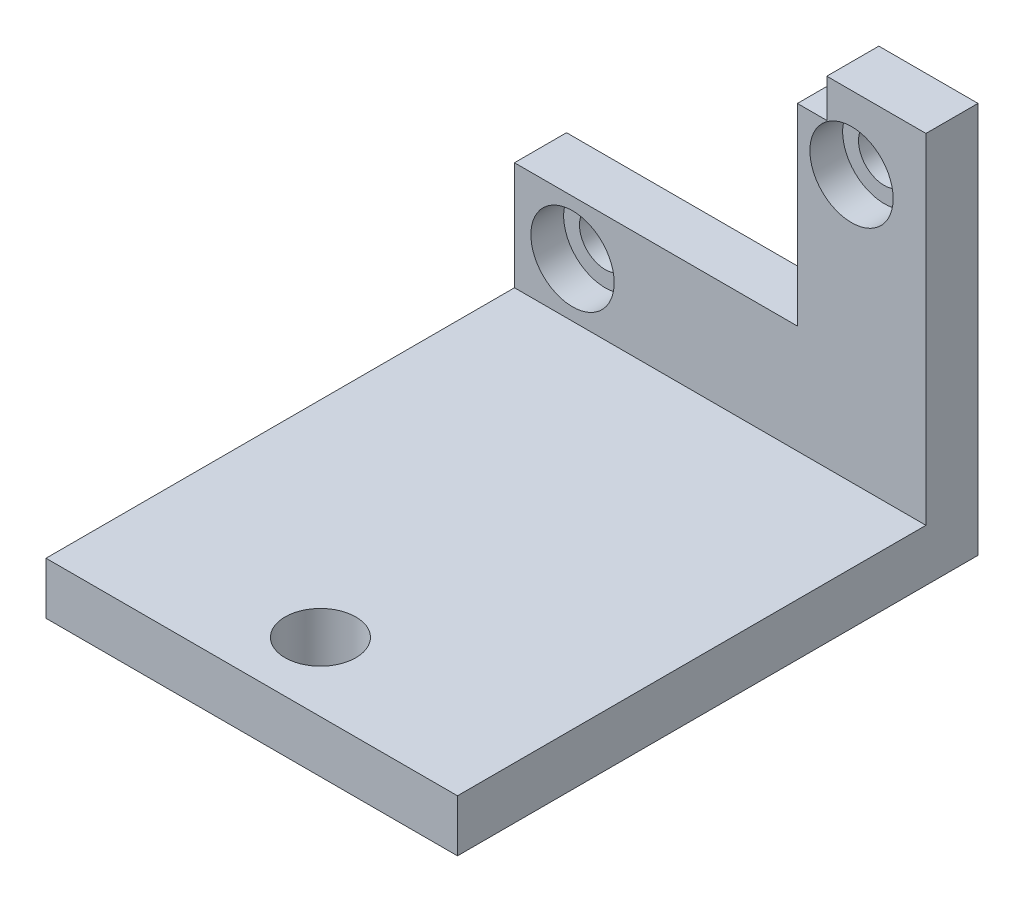
ISO-10303-21;
HEADER;
FILE_DESCRIPTION(('STEP AP214'),'2;1');
FILE_NAME('part.step','',(''),(''),'','','');
FILE_SCHEMA(('AUTOMOTIVE_DESIGN { 1 0 10303 214 1 1 1 1 }'));
ENDSEC;
DATA;
#1=APPLICATION_CONTEXT('core data for automotive mechanical design processes');
#2=APPLICATION_PROTOCOL_DEFINITION('international standard','automotive_design',2000,#1);
#3=PRODUCT_CONTEXT('',#1,'mechanical');
#4=PRODUCT('Part','Part','',(#3));
#5=PRODUCT_RELATED_PRODUCT_CATEGORY('part','',(#4));
#6=PRODUCT_DEFINITION_FORMATION('','',#4);
#7=PRODUCT_DEFINITION_CONTEXT('part definition',#1,'design');
#8=PRODUCT_DEFINITION('design','',#6,#7);
#9=PRODUCT_DEFINITION_SHAPE('','',#8);
#10=(LENGTH_UNIT() NAMED_UNIT(*) SI_UNIT(.MILLI.,.METRE.));
#11=(NAMED_UNIT(*) PLANE_ANGLE_UNIT() SI_UNIT($,.RADIAN.));
#12=(NAMED_UNIT(*) SI_UNIT($,.STERADIAN.) SOLID_ANGLE_UNIT());
#13=UNCERTAINTY_MEASURE_WITH_UNIT(LENGTH_MEASURE(1.E-05),#10,'distance_accuracy_value','');
#14=(GEOMETRIC_REPRESENTATION_CONTEXT(3) GLOBAL_UNCERTAINTY_ASSIGNED_CONTEXT((#13)) GLOBAL_UNIT_ASSIGNED_CONTEXT((#10,
#11,#12)) REPRESENTATION_CONTEXT('',''));
#15=CARTESIAN_POINT('',(0.,0.,0.));
#16=DIRECTION('',(0.,0.,1.));
#17=DIRECTION('',(1.,0.,0.));
#18=AXIS2_PLACEMENT_3D('',#15,#16,#17);
#19=CARTESIAN_POINT('',(-9.32078617099483,-4.74040490381666,3.175));
#20=DIRECTION('',(0.,0.,-1.));
#21=DIRECTION('',(-1.,0.,0.));
#22=AXIS2_PLACEMENT_3D('',#19,#20,#21);
#23=CYLINDRICAL_SURFACE('',#22,1.5748);
#24=CARTESIAN_POINT('',(-9.32078617099483,-4.74040490381666,0.));
#25=DIRECTION('',(0.,0.,1.));
#26=DIRECTION('',(1.,0.,0.));
#27=AXIS2_PLACEMENT_3D('',#24,#25,#26);
#28=CIRCLE('',#27,1.5748);
#29=CARTESIAN_POINT('',(-7.74598617099483,-4.74040490381666,0.));
#30=VERTEX_POINT('',#29);
#31=EDGE_CURVE('E285',#30,#30,#28,.T.);
#32=ORIENTED_EDGE('',*,*,#31,.F.);
#33=EDGE_LOOP('',(#32));
#34=FACE_BOUND('',#33,.T.);
#35=CARTESIAN_POINT('',(-9.32078617099483,-4.74040490381666,1.175));
#36=DIRECTION('',(0.,0.,1.));
#37=DIRECTION('',(1.,0.,0.));
#38=AXIS2_PLACEMENT_3D('',#35,#36,#37);
#39=CIRCLE('',#38,1.5748);
#40=CARTESIAN_POINT('',(-7.74598617099483,-4.74040490381666,1.175));
#41=VERTEX_POINT('',#40);
#42=EDGE_CURVE('E148',#41,#41,#39,.T.);
#43=ORIENTED_EDGE('',*,*,#42,.T.);
#44=EDGE_LOOP('',(#43));
#45=FACE_BOUND('',#44,.T.);
#46=ADVANCED_FACE('F144',(#34,#45),#23,.F.);
#47=CARTESIAN_POINT('',(7.69721382900516,8.21359509618334,3.175));
#48=DIRECTION('',(0.,0.,-1.));
#49=DIRECTION('',(-1.,0.,0.));
#50=AXIS2_PLACEMENT_3D('',#47,#48,#49);
#51=CYLINDRICAL_SURFACE('',#50,1.5748);
#52=CARTESIAN_POINT('',(7.69721382900516,8.21359509618334,0.));
#53=DIRECTION('',(0.,0.,1.));
#54=DIRECTION('',(1.,0.,0.));
#55=AXIS2_PLACEMENT_3D('',#52,#53,#54);
#56=CIRCLE('',#55,1.5748);
#57=CARTESIAN_POINT('',(9.27201382900516,8.21359509618334,0.));
#58=VERTEX_POINT('',#57);
#59=EDGE_CURVE('E300',#58,#58,#56,.T.);
#60=ORIENTED_EDGE('',*,*,#59,.F.);
#61=EDGE_LOOP('',(#60));
#62=FACE_BOUND('',#61,.T.);
#63=CARTESIAN_POINT('',(7.69721382900516,8.21359509618334,1.175));
#64=DIRECTION('',(0.,0.,1.));
#65=DIRECTION('',(1.,0.,0.));
#66=AXIS2_PLACEMENT_3D('',#63,#64,#65);
#67=CIRCLE('',#66,1.5748);
#68=CARTESIAN_POINT('',(9.27201382900516,8.21359509618334,1.175));
#69=VERTEX_POINT('',#68);
#70=EDGE_CURVE('E241',#69,#69,#67,.T.);
#71=ORIENTED_EDGE('',*,*,#70,.T.);
#72=EDGE_LOOP('',(#71));
#73=FACE_BOUND('',#72,.T.);
#74=ADVANCED_FACE('F376',(#62,#73),#51,.F.);
#75=CARTESIAN_POINT('',(0.,-1.43840490381666,3.175));
#76=DIRECTION('',(0.,-1.,0.));
#77=DIRECTION('',(1.,0.,0.));
#78=AXIS2_PLACEMENT_3D('',#75,#76,#77);
#79=PLANE('',#78);
#80=DIRECTION('',(-1.,0.,0.));
#81=VECTOR('',#80,1.);
#82=CARTESIAN_POINT('',(0.,-1.43840490381666,0.));
#83=LINE('',#82,#81);
#84=CARTESIAN_POINT('',(4.39521382900517,-1.43840490381666,0.));
#85=VERTEX_POINT('',#84);
#86=CARTESIAN_POINT('',(-12.8607861709948,-1.43840490381666,0.));
#87=VERTEX_POINT('',#86);
#88=EDGE_CURVE('E205',#85,#87,#83,.T.);
#89=ORIENTED_EDGE('',*,*,#88,.T.);
#90=DIRECTION('',(0.,0.,-1.));
#91=VECTOR('',#90,1.);
#92=CARTESIAN_POINT('',(-12.8607861709948,-1.43840490381666,3.175));
#93=LINE('',#92,#91);
#94=CARTESIAN_POINT('',(-12.8607861709948,-1.43840490381666,3.175));
#95=VERTEX_POINT('',#94);
#96=EDGE_CURVE('E12',#95,#87,#93,.T.);
#97=ORIENTED_EDGE('',*,*,#96,.F.);
#98=DIRECTION('',(-1.,0.,0.));
#99=VECTOR('',#98,1.);
#100=CARTESIAN_POINT('',(0.,-1.43840490381666,3.175));
#101=LINE('',#100,#99);
#102=CARTESIAN_POINT('',(4.39521382900517,-1.43840490381666,3.175));
#103=VERTEX_POINT('',#102);
#104=EDGE_CURVE('E227',#103,#95,#101,.T.);
#105=ORIENTED_EDGE('',*,*,#104,.F.);
#106=DIRECTION('',(0.,0.,-1.));
#107=VECTOR('',#106,1.);
#108=CARTESIAN_POINT('',(4.39521382900517,-1.43840490381666,3.175));
#109=LINE('',#108,#107);
#110=EDGE_CURVE('E220',#103,#85,#109,.T.);
#111=ORIENTED_EDGE('',*,*,#110,.T.);
#112=EDGE_LOOP('',(#89,#97,#105,#111));
#113=FACE_BOUND('',#112,.T.);
#114=ADVANCED_FACE('F226',(#113),#79,.F.);
#115=CARTESIAN_POINT('',(-12.8607861709948,0.,3.175));
#116=DIRECTION('',(1.,0.,0.));
#117=DIRECTION('',(0.,0.,-1.));
#118=AXIS2_PLACEMENT_3D('',#115,#116,#117);
#119=PLANE('',#118);
#120=DIRECTION('',(0.,-1.,0.));
#121=VECTOR('',#120,1.);
#122=CARTESIAN_POINT('',(-12.8607861709948,0.,0.));
#123=LINE('',#122,#121);
#124=CARTESIAN_POINT('',(-12.8607861709948,-11.2174049038166,0.));
#125=VERTEX_POINT('',#124);
#126=EDGE_CURVE('E210',#87,#125,#123,.T.);
#127=ORIENTED_EDGE('',*,*,#126,.T.);
#128=DIRECTION('',(0.,0.,-1.));
#129=VECTOR('',#128,1.);
#130=CARTESIAN_POINT('',(-12.8607861709948,-11.2174049038166,31.75));
#131=LINE('',#130,#129);
#132=CARTESIAN_POINT('',(-12.8607861709948,-11.2174049038166,31.75));
#133=VERTEX_POINT('',#132);
#134=EDGE_CURVE('E288',#133,#125,#131,.T.);
#135=ORIENTED_EDGE('',*,*,#134,.F.);
#136=DIRECTION('',(0.,1.,0.));
#137=VECTOR('',#136,1.);
#138=CARTESIAN_POINT('',(-12.8607861709948,-8.04240490381664,31.75));
#139=LINE('',#138,#137);
#140=CARTESIAN_POINT('',(-12.8607861709948,-8.04240490381664,31.75));
#141=VERTEX_POINT('',#140);
#142=EDGE_CURVE('E274',#133,#141,#139,.T.);
#143=ORIENTED_EDGE('',*,*,#142,.T.);
#144=DIRECTION('',(0.,0.,-1.));
#145=VECTOR('',#144,1.);
#146=CARTESIAN_POINT('',(-12.8607861709948,-8.04240490381664,31.75));
#147=LINE('',#146,#145);
#148=CARTESIAN_POINT('',(-12.8607861709948,-8.04240490381664,3.175));
#149=VERTEX_POINT('',#148);
#150=EDGE_CURVE('E286',#141,#149,#147,.T.);
#151=ORIENTED_EDGE('',*,*,#150,.T.);
#152=DIRECTION('',(0.,-1.,0.));
#153=VECTOR('',#152,1.);
#154=CARTESIAN_POINT('',(-12.8607861709948,0.,3.175));
#155=LINE('',#154,#153);
#156=EDGE_CURVE('E162',#95,#149,#155,.T.);
#157=ORIENTED_EDGE('',*,*,#156,.F.);
#158=ORIENTED_EDGE('',*,*,#96,.T.);
#159=EDGE_LOOP('',(#127,#135,#143,#151,#157,#158));
#160=FACE_BOUND('',#159,.T.);
#161=ADVANCED_FACE('F355',(#160),#119,.F.);
#162=CARTESIAN_POINT('',(0.,0.,3.175));
#163=DIRECTION('',(0.,0.,1.));
#164=DIRECTION('',(1.,0.,0.));
#165=AXIS2_PLACEMENT_3D('',#162,#163,#164);
#166=PLANE('',#165);
#167=CARTESIAN_POINT('',(7.69721382900516,8.21359509618334,3.175));
#168=DIRECTION('',(0.,0.,1.));
#169=DIRECTION('',(1.,0.,0.));
#170=AXIS2_PLACEMENT_3D('',#167,#168,#169);
#171=CIRCLE('',#170,2.54);
#172=CARTESIAN_POINT('',(10.2372138290052,8.21359509618334,3.175));
#173=VERTEX_POINT('',#172);
#174=EDGE_CURVE('E249',#173,#173,#171,.T.);
#175=ORIENTED_EDGE('',*,*,#174,.F.);
#176=EDGE_LOOP('',(#175));
#177=FACE_BOUND('',#176,.T.);
#178=CARTESIAN_POINT('',(-9.32078617099483,-4.74040490381666,3.175));
#179=DIRECTION('',(0.,0.,1.));
#180=DIRECTION('',(1.,0.,0.));
#181=AXIS2_PLACEMENT_3D('',#178,#179,#180);
#182=CIRCLE('',#181,2.54);
#183=CARTESIAN_POINT('',(-6.78078617099483,-4.74040490381666,3.175));
#184=VERTEX_POINT('',#183);
#185=EDGE_CURVE('E259',#184,#184,#182,.T.);
#186=ORIENTED_EDGE('',*,*,#185,.F.);
#187=EDGE_LOOP('',(#186));
#188=FACE_BOUND('',#187,.T.);
#189=ORIENTED_EDGE('',*,*,#104,.T.);
#190=ORIENTED_EDGE('',*,*,#156,.T.);
#191=DIRECTION('',(-1.,0.,0.));
#192=VECTOR('',#191,1.);
#193=CARTESIAN_POINT('',(0.,-8.04240490381664,3.175));
#194=LINE('',#193,#192);
#195=CARTESIAN_POINT('',(12.2372138290052,-8.04240490381664,3.175));
#196=VERTEX_POINT('',#195);
#197=EDGE_CURVE('E154',#196,#149,#194,.T.);
#198=ORIENTED_EDGE('',*,*,#197,.F.);
#199=DIRECTION('',(0.,1.,0.));
#200=VECTOR('',#199,1.);
#201=CARTESIAN_POINT('',(12.2372138290052,-8.04240490381664,3.175));
#202=LINE('',#201,#200);
#203=CARTESIAN_POINT('',(12.2372138290052,12.6585950961833,3.175));
#204=VERTEX_POINT('',#203);
#205=EDGE_CURVE('E223',#196,#204,#202,.T.);
#206=ORIENTED_EDGE('',*,*,#205,.T.);
#207=DIRECTION('',(-1.,0.,0.));
#208=VECTOR('',#207,1.);
#209=CARTESIAN_POINT('',(12.2372138290052,12.6585950961833,3.175));
#210=LINE('',#209,#208);
#211=CARTESIAN_POINT('',(6.18817038186677,12.6585950961833,3.175));
#212=VERTEX_POINT('',#211);
#213=EDGE_CURVE('E305',#204,#212,#210,.T.);
#214=ORIENTED_EDGE('',*,*,#213,.T.);
#215=DIRECTION('',(0.,1.,0.));
#216=VECTOR('',#215,1.);
#217=CARTESIAN_POINT('',(6.18817038186677,10.3218119533511,3.175));
#218=LINE('',#217,#216);
#219=CARTESIAN_POINT('',(6.18817038186677,10.3218119533511,3.175));
#220=VERTEX_POINT('',#219);
#221=EDGE_CURVE('E307',#220,#212,#218,.T.);
#222=ORIENTED_EDGE('',*,*,#221,.F.);
#223=DIRECTION('',(1.,0.,0.));
#224=VECTOR('',#223,1.);
#225=CARTESIAN_POINT('',(4.39521382900517,10.3218119533511,3.175));
#226=LINE('',#225,#224);
#227=CARTESIAN_POINT('',(4.39521382900517,10.3218119533511,3.175));
#228=VERTEX_POINT('',#227);
#229=EDGE_CURVE('E233',#228,#220,#226,.T.);
#230=ORIENTED_EDGE('',*,*,#229,.F.);
#231=DIRECTION('',(0.,-1.,0.));
#232=VECTOR('',#231,1.);
#233=CARTESIAN_POINT('',(4.39521382900517,10.3218119533511,3.175));
#234=LINE('',#233,#232);
#235=EDGE_CURVE('E229',#228,#103,#234,.T.);
#236=ORIENTED_EDGE('',*,*,#235,.T.);
#237=EDGE_LOOP('',(#189,#190,#198,#206,#214,#222,#230,#236));
#238=FACE_BOUND('',#237,.T.);
#239=ADVANCED_FACE('F362',(#177,#188,#238),#166,.T.);
#240=CARTESIAN_POINT('',(0.,0.,0.));
#241=DIRECTION('',(0.,0.,1.));
#242=DIRECTION('',(1.,0.,0.));
#243=AXIS2_PLACEMENT_3D('',#240,#241,#242);
#244=PLANE('',#243);
#245=ORIENTED_EDGE('',*,*,#88,.F.);
#246=DIRECTION('',(0.,-1.,0.));
#247=VECTOR('',#246,1.);
#248=CARTESIAN_POINT('',(4.39521382900517,7.82738812093123,0.));
#249=LINE('',#248,#247);
#250=CARTESIAN_POINT('',(4.39521382900517,10.3218119533511,0.));
#251=VERTEX_POINT('',#250);
#252=EDGE_CURVE('E202',#251,#85,#249,.T.);
#253=ORIENTED_EDGE('',*,*,#252,.F.);
#254=DIRECTION('',(1.,0.,0.));
#255=VECTOR('',#254,1.);
#256=CARTESIAN_POINT('',(4.39521382900517,10.3218119533511,0.));
#257=LINE('',#256,#255);
#258=CARTESIAN_POINT('',(6.18817038186677,10.3218119533511,0.));
#259=VERTEX_POINT('',#258);
#260=EDGE_CURVE('E224',#251,#259,#257,.T.);
#261=ORIENTED_EDGE('',*,*,#260,.T.);
#262=DIRECTION('',(0.,1.,0.));
#263=VECTOR('',#262,1.);
#264=CARTESIAN_POINT('',(6.18817038186677,10.3218119533511,0.));
#265=LINE('',#264,#263);
#266=CARTESIAN_POINT('',(6.18817038186677,12.6585950961833,0.));
#267=VERTEX_POINT('',#266);
#268=EDGE_CURVE('E317',#259,#267,#265,.T.);
#269=ORIENTED_EDGE('',*,*,#268,.T.);
#270=DIRECTION('',(-1.,0.,0.));
#271=VECTOR('',#270,1.);
#272=CARTESIAN_POINT('',(7.69721382900516,12.6585950961833,0.));
#273=LINE('',#272,#271);
#274=CARTESIAN_POINT('',(12.2372138290052,12.6585950961833,0.));
#275=VERTEX_POINT('',#274);
#276=EDGE_CURVE('E314',#275,#267,#273,.T.);
#277=ORIENTED_EDGE('',*,*,#276,.F.);
#278=DIRECTION('',(0.,1.,0.));
#279=VECTOR('',#278,1.);
#280=CARTESIAN_POINT('',(12.2372138290052,-8.04240490381664,0.));
#281=LINE('',#280,#279);
#282=CARTESIAN_POINT('',(12.2372138290052,-11.2174049038166,0.));
#283=VERTEX_POINT('',#282);
#284=EDGE_CURVE('E303',#283,#275,#281,.T.);
#285=ORIENTED_EDGE('',*,*,#284,.F.);
#286=DIRECTION('',(-1.,0.,0.));
#287=VECTOR('',#286,1.);
#288=CARTESIAN_POINT('',(12.2372138290052,-11.2174049038166,0.));
#289=LINE('',#288,#287);
#290=EDGE_CURVE('E267',#283,#125,#289,.T.);
#291=ORIENTED_EDGE('',*,*,#290,.T.);
#292=ORIENTED_EDGE('',*,*,#126,.F.);
#293=EDGE_LOOP('',(#245,#253,#261,#269,#277,#285,#291,#292));
#294=FACE_BOUND('',#293,.T.);
#295=ORIENTED_EDGE('',*,*,#59,.T.);
#296=EDGE_LOOP('',(#295));
#297=FACE_BOUND('',#296,.T.);
#298=ORIENTED_EDGE('',*,*,#31,.T.);
#299=EDGE_LOOP('',(#298));
#300=FACE_BOUND('',#299,.T.);
#301=ADVANCED_FACE('F206',(#294,#297,#300),#244,.F.);
#302=CARTESIAN_POINT('',(4.39521382900517,7.82738812093123,3.175));
#303=DIRECTION('',(1.,0.,0.));
#304=DIRECTION('',(0.,0.,-1.));
#305=AXIS2_PLACEMENT_3D('',#302,#303,#304);
#306=PLANE('',#305);
#307=ORIENTED_EDGE('',*,*,#252,.T.);
#308=ORIENTED_EDGE('',*,*,#110,.F.);
#309=ORIENTED_EDGE('',*,*,#235,.F.);
#310=DIRECTION('',(0.,0.,-1.));
#311=VECTOR('',#310,1.);
#312=CARTESIAN_POINT('',(4.39521382900517,10.3218119533511,3.175));
#313=LINE('',#312,#311);
#314=EDGE_CURVE('E221',#228,#251,#313,.T.);
#315=ORIENTED_EDGE('',*,*,#314,.T.);
#316=EDGE_LOOP('',(#307,#308,#309,#315));
#317=FACE_BOUND('',#316,.T.);
#318=ADVANCED_FACE('F218',(#317),#306,.F.);
#319=CARTESIAN_POINT('',(4.39521382900517,10.3218119533511,3.175));
#320=DIRECTION('',(0.,1.,0.));
#321=DIRECTION('',(0.,0.,1.));
#322=AXIS2_PLACEMENT_3D('',#319,#320,#321);
#323=PLANE('',#322);
#324=ORIENTED_EDGE('',*,*,#260,.F.);
#325=ORIENTED_EDGE('',*,*,#314,.F.);
#326=ORIENTED_EDGE('',*,*,#229,.T.);
#327=DIRECTION('',(0.,0.,-1.));
#328=VECTOR('',#327,1.);
#329=CARTESIAN_POINT('',(6.18817038186677,10.3218119533511,3.175));
#330=LINE('',#329,#328);
#331=EDGE_CURVE('E231',#220,#259,#330,.T.);
#332=ORIENTED_EDGE('',*,*,#331,.T.);
#333=EDGE_LOOP('',(#324,#325,#326,#332));
#334=FACE_BOUND('',#333,.T.);
#335=ADVANCED_FACE('F321',(#334),#323,.T.);
#336=CARTESIAN_POINT('',(6.18817038186677,10.3218119533511,3.175));
#337=DIRECTION('',(-1.,0.,0.));
#338=DIRECTION('',(0.,0.,1.));
#339=AXIS2_PLACEMENT_3D('',#336,#337,#338);
#340=PLANE('',#339);
#341=ORIENTED_EDGE('',*,*,#268,.F.);
#342=ORIENTED_EDGE('',*,*,#331,.F.);
#343=ORIENTED_EDGE('',*,*,#221,.T.);
#344=DIRECTION('',(0.,0.,-1.));
#345=VECTOR('',#344,1.);
#346=CARTESIAN_POINT('',(6.18817038186677,12.6585950961833,3.175));
#347=LINE('',#346,#345);
#348=EDGE_CURVE('E238',#212,#267,#347,.T.);
#349=ORIENTED_EDGE('',*,*,#348,.T.);
#350=EDGE_LOOP('',(#341,#342,#343,#349));
#351=FACE_BOUND('',#350,.T.);
#352=ADVANCED_FACE('F325',(#351),#340,.T.);
#353=CARTESIAN_POINT('',(7.69721382900516,12.6585950961833,3.175));
#354=DIRECTION('',(0.,-1.,0.));
#355=DIRECTION('',(1.,0.,0.));
#356=AXIS2_PLACEMENT_3D('',#353,#354,#355);
#357=PLANE('',#356);
#358=ORIENTED_EDGE('',*,*,#276,.T.);
#359=ORIENTED_EDGE('',*,*,#348,.F.);
#360=ORIENTED_EDGE('',*,*,#213,.F.);
#361=DIRECTION('',(0.,0.,-1.));
#362=VECTOR('',#361,1.);
#363=CARTESIAN_POINT('',(12.2372138290052,12.6585950961833,3.175));
#364=LINE('',#363,#362);
#365=EDGE_CURVE('E214',#204,#275,#364,.T.);
#366=ORIENTED_EDGE('',*,*,#365,.T.);
#367=EDGE_LOOP('',(#358,#359,#360,#366));
#368=FACE_BOUND('',#367,.T.);
#369=ADVANCED_FACE('F329',(#368),#357,.F.);
#370=CARTESIAN_POINT('',(12.2372138290052,-8.04240490381664,3.175));
#371=DIRECTION('',(-1.,0.,0.));
#372=DIRECTION('',(0.,0.,1.));
#373=AXIS2_PLACEMENT_3D('',#370,#371,#372);
#374=PLANE('',#373);
#375=ORIENTED_EDGE('',*,*,#284,.T.);
#376=ORIENTED_EDGE('',*,*,#365,.F.);
#377=ORIENTED_EDGE('',*,*,#205,.F.);
#378=DIRECTION('',(0.,0.,-1.));
#379=VECTOR('',#378,1.);
#380=CARTESIAN_POINT('',(12.2372138290052,-8.04240490381664,31.75));
#381=LINE('',#380,#379);
#382=CARTESIAN_POINT('',(12.2372138290052,-8.04240490381664,31.75));
#383=VERTEX_POINT('',#382);
#384=EDGE_CURVE('E282',#383,#196,#381,.T.);
#385=ORIENTED_EDGE('',*,*,#384,.F.);
#386=DIRECTION('',(0.,-1.,0.));
#387=VECTOR('',#386,1.);
#388=CARTESIAN_POINT('',(12.2372138290052,-8.04240490381664,31.75));
#389=LINE('',#388,#387);
#390=CARTESIAN_POINT('',(12.2372138290052,-11.2174049038166,31.75));
#391=VERTEX_POINT('',#390);
#392=EDGE_CURVE('E268',#383,#391,#389,.T.);
#393=ORIENTED_EDGE('',*,*,#392,.T.);
#394=DIRECTION('',(0.,0.,-1.));
#395=VECTOR('',#394,1.);
#396=CARTESIAN_POINT('',(12.2372138290052,-11.2174049038166,31.75));
#397=LINE('',#396,#395);
#398=EDGE_CURVE('E280',#391,#283,#397,.T.);
#399=ORIENTED_EDGE('',*,*,#398,.T.);
#400=EDGE_LOOP('',(#375,#376,#377,#385,#393,#399));
#401=FACE_BOUND('',#400,.T.);
#402=ADVANCED_FACE('F146',(#401),#374,.F.);
#403=CARTESIAN_POINT('',(12.2372138290052,-8.04240490381664,31.75));
#404=DIRECTION('',(0.,1.,0.));
#405=DIRECTION('',(0.,0.,1.));
#406=AXIS2_PLACEMENT_3D('',#403,#404,#405);
#407=PLANE('',#406);
#408=CARTESIAN_POINT('',(-0.311786170994833,-8.04240490381664,27.559));
#409=DIRECTION('',(0.,1.,0.));
#410=DIRECTION('',(0.,0.,1.));
#411=AXIS2_PLACEMENT_3D('',#408,#409,#410);
#412=CIRCLE('',#411,2.159);
#413=CARTESIAN_POINT('',(-0.311786170994833,-8.04240490381664,29.718));
#414=VERTEX_POINT('',#413);
#415=EDGE_CURVE('E264',#414,#414,#412,.T.);
#416=ORIENTED_EDGE('',*,*,#415,.F.);
#417=EDGE_LOOP('',(#416));
#418=FACE_BOUND('',#417,.T.);
#419=ORIENTED_EDGE('',*,*,#384,.T.);
#420=ORIENTED_EDGE('',*,*,#197,.T.);
#421=ORIENTED_EDGE('',*,*,#150,.F.);
#422=DIRECTION('',(1.,0.,0.));
#423=VECTOR('',#422,1.);
#424=CARTESIAN_POINT('',(12.2372138290052,-8.04240490381664,31.75));
#425=LINE('',#424,#423);
#426=EDGE_CURVE('E277',#141,#383,#425,.T.);
#427=ORIENTED_EDGE('',*,*,#426,.T.);
#428=EDGE_LOOP('',(#419,#420,#421,#427));
#429=FACE_BOUND('',#428,.T.);
#430=ADVANCED_FACE('F360',(#418,#429),#407,.T.);
#431=CARTESIAN_POINT('',(12.2372138290052,-11.2174049038166,31.75));
#432=DIRECTION('',(0.,-1.,0.));
#433=DIRECTION('',(0.,0.,-1.));
#434=AXIS2_PLACEMENT_3D('',#431,#432,#433);
#435=PLANE('',#434);
#436=CARTESIAN_POINT('',(-0.311786170994833,-11.2174049038166,27.559));
#437=DIRECTION('',(0.,-1.,0.));
#438=DIRECTION('',(0.,0.,-1.));
#439=AXIS2_PLACEMENT_3D('',#436,#437,#438);
#440=CIRCLE('',#439,2.159);
#441=CARTESIAN_POINT('',(-0.311786170994833,-11.2174049038166,25.4));
#442=VERTEX_POINT('',#441);
#443=EDGE_CURVE('E247',#442,#442,#440,.T.);
#444=ORIENTED_EDGE('',*,*,#443,.F.);
#445=EDGE_LOOP('',(#444));
#446=FACE_BOUND('',#445,.T.);
#447=ORIENTED_EDGE('',*,*,#290,.F.);
#448=ORIENTED_EDGE('',*,*,#398,.F.);
#449=DIRECTION('',(-1.,0.,0.));
#450=VECTOR('',#449,1.);
#451=CARTESIAN_POINT('',(12.2372138290052,-11.2174049038166,31.75));
#452=LINE('',#451,#450);
#453=EDGE_CURVE('E271',#391,#133,#452,.T.);
#454=ORIENTED_EDGE('',*,*,#453,.T.);
#455=ORIENTED_EDGE('',*,*,#134,.T.);
#456=EDGE_LOOP('',(#447,#448,#454,#455));
#457=FACE_BOUND('',#456,.T.);
#458=ADVANCED_FACE('F344',(#446,#457),#435,.T.);
#459=CARTESIAN_POINT('',(0.,0.,31.75));
#460=DIRECTION('',(0.,0.,-1.));
#461=DIRECTION('',(-1.,0.,0.));
#462=AXIS2_PLACEMENT_3D('',#459,#460,#461);
#463=PLANE('',#462);
#464=ORIENTED_EDGE('',*,*,#392,.F.);
#465=ORIENTED_EDGE('',*,*,#426,.F.);
#466=ORIENTED_EDGE('',*,*,#142,.F.);
#467=ORIENTED_EDGE('',*,*,#453,.F.);
#468=EDGE_LOOP('',(#464,#465,#466,#467));
#469=FACE_BOUND('',#468,.T.);
#470=ADVANCED_FACE('F358',(#469),#463,.F.);
#471=CARTESIAN_POINT('',(-0.311786170994833,12.6585950961833,27.559));
#472=DIRECTION('',(0.,-1.,0.));
#473=DIRECTION('',(0.,0.,-1.));
#474=AXIS2_PLACEMENT_3D('',#471,#472,#473);
#475=CYLINDRICAL_SURFACE('',#474,2.159);
#476=ORIENTED_EDGE('',*,*,#415,.T.);
#477=EDGE_LOOP('',(#476));
#478=FACE_BOUND('',#477,.T.);
#479=ORIENTED_EDGE('',*,*,#443,.T.);
#480=EDGE_LOOP('',(#479));
#481=FACE_BOUND('',#480,.T.);
#482=ADVANCED_FACE('F410',(#478,#481),#475,.F.);
#483=CARTESIAN_POINT('',(7.69721382900516,8.21359509618334,1.175));
#484=DIRECTION('',(0.,0.,1.));
#485=DIRECTION('',(1.,0.,0.));
#486=AXIS2_PLACEMENT_3D('',#483,#484,#485);
#487=CYLINDRICAL_SURFACE('',#486,2.54);
#488=CARTESIAN_POINT('',(7.69721382900516,8.21359509618334,1.175));
#489=DIRECTION('',(0.,0.,1.));
#490=DIRECTION('',(1.,0.,0.));
#491=AXIS2_PLACEMENT_3D('',#488,#489,#490);
#492=CIRCLE('',#491,2.54);
#493=CARTESIAN_POINT('',(10.2372138290052,8.21359509618334,1.175));
#494=VERTEX_POINT('',#493);
#495=EDGE_CURVE('E243',#494,#494,#492,.T.);
#496=ORIENTED_EDGE('',*,*,#495,.F.);
#497=EDGE_LOOP('',(#496));
#498=FACE_BOUND('',#497,.T.);
#499=ORIENTED_EDGE('',*,*,#174,.T.);
#500=EDGE_LOOP('',(#499));
#501=FACE_BOUND('',#500,.T.);
#502=ADVANCED_FACE('F413',(#498,#501),#487,.F.);
#503=CARTESIAN_POINT('',(7.69721382900516,8.21359509618334,1.175));
#504=DIRECTION('',(0.,0.,1.));
#505=DIRECTION('',(1.,0.,0.));
#506=AXIS2_PLACEMENT_3D('',#503,#504,#505);
#507=PLANE('',#506);
#508=ORIENTED_EDGE('',*,*,#70,.F.);
#509=EDGE_LOOP('',(#508));
#510=FACE_BOUND('',#509,.T.);
#511=ORIENTED_EDGE('',*,*,#495,.T.);
#512=EDGE_LOOP('',(#511));
#513=FACE_BOUND('',#512,.T.);
#514=ADVANCED_FACE('F419',(#510,#513),#507,.T.);
#515=CARTESIAN_POINT('',(-9.32078617099483,-4.74040490381666,1.175));
#516=DIRECTION('',(0.,0.,1.));
#517=DIRECTION('',(1.,0.,0.));
#518=AXIS2_PLACEMENT_3D('',#515,#516,#517);
#519=CYLINDRICAL_SURFACE('',#518,2.54);
#520=CARTESIAN_POINT('',(-9.32078617099483,-4.74040490381666,1.175));
#521=DIRECTION('',(0.,0.,1.));
#522=DIRECTION('',(1.,0.,0.));
#523=AXIS2_PLACEMENT_3D('',#520,#521,#522);
#524=CIRCLE('',#523,2.54);
#525=CARTESIAN_POINT('',(-6.78078617099483,-4.74040490381666,1.175));
#526=VERTEX_POINT('',#525);
#527=EDGE_CURVE('E254',#526,#526,#524,.T.);
#528=ORIENTED_EDGE('',*,*,#527,.F.);
#529=EDGE_LOOP('',(#528));
#530=FACE_BOUND('',#529,.T.);
#531=ORIENTED_EDGE('',*,*,#185,.T.);
#532=EDGE_LOOP('',(#531));
#533=FACE_BOUND('',#532,.T.);
#534=ADVANCED_FACE('F415',(#530,#533),#519,.F.);
#535=CARTESIAN_POINT('',(-9.32078617099483,-4.74040490381666,1.175));
#536=DIRECTION('',(0.,0.,1.));
#537=DIRECTION('',(1.,0.,0.));
#538=AXIS2_PLACEMENT_3D('',#535,#536,#537);
#539=PLANE('',#538);
#540=ORIENTED_EDGE('',*,*,#42,.F.);
#541=EDGE_LOOP('',(#540));
#542=FACE_BOUND('',#541,.T.);
#543=ORIENTED_EDGE('',*,*,#527,.T.);
#544=EDGE_LOOP('',(#543));
#545=FACE_BOUND('',#544,.T.);
#546=ADVANCED_FACE('F418',(#542,#545),#539,.T.);
#547=CLOSED_SHELL('',(#46,#74,#114,#161,#239,#301,#318,#335,#352,#369,#402,#430,#458,#470,#482,
#502,#514,#534,#546));
#548=MANIFOLD_SOLID_BREP('B2',#547);
#549=ADVANCED_BREP_SHAPE_REPRESENTATION('',(#18,#548),#14);
#550=SHAPE_DEFINITION_REPRESENTATION(#9,#549);
ENDSEC;
END-ISO-10303-21;
